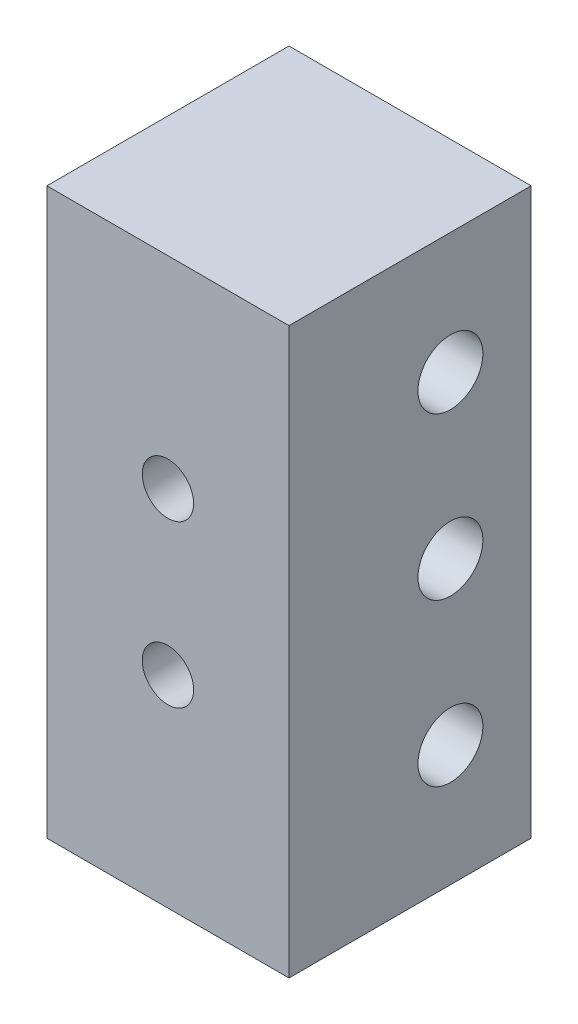
ISO-10303-21;
HEADER;
FILE_DESCRIPTION(('STEP AP214'),'2;1');
FILE_NAME('part.step','',(''),(''),'','','');
FILE_SCHEMA(('AUTOMOTIVE_DESIGN { 1 0 10303 214 1 1 1 1 }'));
ENDSEC;
DATA;
#1=APPLICATION_CONTEXT('core data for automotive mechanical design processes');
#2=APPLICATION_PROTOCOL_DEFINITION('international standard','automotive_design',2000,#1);
#3=PRODUCT_CONTEXT('',#1,'mechanical');
#4=PRODUCT('Part','Part','',(#3));
#5=PRODUCT_RELATED_PRODUCT_CATEGORY('part','',(#4));
#6=PRODUCT_DEFINITION_FORMATION('','',#4);
#7=PRODUCT_DEFINITION_CONTEXT('part definition',#1,'design');
#8=PRODUCT_DEFINITION('design','',#6,#7);
#9=PRODUCT_DEFINITION_SHAPE('','',#8);
#10=(LENGTH_UNIT() NAMED_UNIT(*) SI_UNIT(.MILLI.,.METRE.));
#11=(NAMED_UNIT(*) PLANE_ANGLE_UNIT() SI_UNIT($,.RADIAN.));
#12=(NAMED_UNIT(*) SI_UNIT($,.STERADIAN.) SOLID_ANGLE_UNIT());
#13=UNCERTAINTY_MEASURE_WITH_UNIT(LENGTH_MEASURE(1.E-05),#10,'distance_accuracy_value','');
#14=(GEOMETRIC_REPRESENTATION_CONTEXT(3) GLOBAL_UNCERTAINTY_ASSIGNED_CONTEXT((#13)) GLOBAL_UNIT_ASSIGNED_CONTEXT((#10,
#11,#12)) REPRESENTATION_CONTEXT('',''));
#15=CARTESIAN_POINT('',(0.,0.,0.));
#16=DIRECTION('',(0.,0.,1.));
#17=DIRECTION('',(1.,0.,0.));
#18=AXIS2_PLACEMENT_3D('',#15,#16,#17);
#19=CARTESIAN_POINT('',(0.,22.225,0.));
#20=DIRECTION('',(1.,0.,0.));
#21=DIRECTION('',(0.,0.,-1.));
#22=AXIS2_PLACEMENT_3D('',#19,#20,#21);
#23=PLANE('',#22);
#24=CARTESIAN_POINT('',(0.,12.7,-12.7));
#25=DIRECTION('',(-1.,0.,0.));
#26=DIRECTION('',(0.,0.,1.));
#27=AXIS2_PLACEMENT_3D('',#24,#25,#26);
#28=CIRCLE('',#27,2.5527);
#29=CARTESIAN_POINT('',(0.,12.7,-10.1473));
#30=VERTEX_POINT('',#29);
#31=EDGE_CURVE('E132',#30,#30,#28,.T.);
#32=ORIENTED_EDGE('',*,*,#31,.F.);
#33=EDGE_LOOP('',(#32));
#34=FACE_BOUND('',#33,.T.);
#35=CARTESIAN_POINT('',(0.,-12.7,-12.7));
#36=DIRECTION('',(-1.,0.,0.));
#37=DIRECTION('',(0.,0.,1.));
#38=AXIS2_PLACEMENT_3D('',#35,#36,#37);
#39=CIRCLE('',#38,2.5527);
#40=CARTESIAN_POINT('',(0.,-12.7,-10.1473));
#41=VERTEX_POINT('',#40);
#42=EDGE_CURVE('E126',#41,#41,#39,.T.);
#43=ORIENTED_EDGE('',*,*,#42,.F.);
#44=EDGE_LOOP('',(#43));
#45=FACE_BOUND('',#44,.T.);
#46=CARTESIAN_POINT('',(0.,0.,-12.7));
#47=DIRECTION('',(-1.,0.,0.));
#48=DIRECTION('',(0.,0.,1.));
#49=AXIS2_PLACEMENT_3D('',#46,#47,#48);
#50=CIRCLE('',#49,2.5527);
#51=CARTESIAN_POINT('',(0.,0.,-10.1473));
#52=VERTEX_POINT('',#51);
#53=EDGE_CURVE('E119',#52,#52,#50,.T.);
#54=ORIENTED_EDGE('',*,*,#53,.F.);
#55=EDGE_LOOP('',(#54));
#56=FACE_BOUND('',#55,.T.);
#57=DIRECTION('',(0.,0.,1.));
#58=VECTOR('',#57,1.);
#59=CARTESIAN_POINT('',(0.,-22.225,0.));
#60=LINE('',#59,#58);
#61=CARTESIAN_POINT('',(0.,-22.225,-19.05));
#62=VERTEX_POINT('',#61);
#63=CARTESIAN_POINT('',(0.,-22.225,0.));
#64=VERTEX_POINT('',#63);
#65=EDGE_CURVE('E105',#62,#64,#60,.T.);
#66=ORIENTED_EDGE('',*,*,#65,.T.);
#67=DIRECTION('',(0.,-1.,0.));
#68=VECTOR('',#67,1.);
#69=CARTESIAN_POINT('',(0.,22.225,0.));
#70=LINE('',#69,#68);
#71=CARTESIAN_POINT('',(0.,22.225,0.));
#72=VERTEX_POINT('',#71);
#73=EDGE_CURVE('E11',#72,#64,#70,.T.);
#74=ORIENTED_EDGE('',*,*,#73,.F.);
#75=DIRECTION('',(0.,0.,1.));
#76=VECTOR('',#75,1.);
#77=CARTESIAN_POINT('',(0.,22.225,0.));
#78=LINE('',#77,#76);
#79=CARTESIAN_POINT('',(0.,22.225,-19.05));
#80=VERTEX_POINT('',#79);
#81=EDGE_CURVE('E93',#80,#72,#78,.T.);
#82=ORIENTED_EDGE('',*,*,#81,.F.);
#83=DIRECTION('',(0.,-1.,0.));
#84=VECTOR('',#83,1.);
#85=CARTESIAN_POINT('',(0.,22.225,-19.05));
#86=LINE('',#85,#84);
#87=EDGE_CURVE('E101',#80,#62,#86,.T.);
#88=ORIENTED_EDGE('',*,*,#87,.T.);
#89=EDGE_LOOP('',(#66,#74,#82,#88));
#90=FACE_BOUND('',#89,.T.);
#91=ADVANCED_FACE('F42',(#34,#45,#56,#90),#23,.F.);
#92=CARTESIAN_POINT('',(0.,22.225,0.));
#93=DIRECTION('',(0.,0.,-1.));
#94=DIRECTION('',(-1.,0.,0.));
#95=AXIS2_PLACEMENT_3D('',#92,#93,#94);
#96=PLANE('',#95);
#97=CARTESIAN_POINT('',(9.525,-6.35,0.));
#98=DIRECTION('',(0.,0.,-1.));
#99=DIRECTION('',(-1.,0.,0.));
#100=AXIS2_PLACEMENT_3D('',#97,#98,#99);
#101=CIRCLE('',#100,2.01929999999999);
#102=CARTESIAN_POINT('',(7.50570000000001,-6.35,0.));
#103=VERTEX_POINT('',#102);
#104=EDGE_CURVE('E142',#103,#103,#101,.T.);
#105=ORIENTED_EDGE('',*,*,#104,.T.);
#106=EDGE_LOOP('',(#105));
#107=FACE_BOUND('',#106,.T.);
#108=CARTESIAN_POINT('',(9.525,6.35,0.));
#109=DIRECTION('',(0.,0.,-1.));
#110=DIRECTION('',(-1.,0.,0.));
#111=AXIS2_PLACEMENT_3D('',#108,#109,#110);
#112=CIRCLE('',#111,2.01929999999999);
#113=CARTESIAN_POINT('',(7.50570000000001,6.35,0.));
#114=VERTEX_POINT('',#113);
#115=EDGE_CURVE('E123',#114,#114,#112,.T.);
#116=ORIENTED_EDGE('',*,*,#115,.T.);
#117=EDGE_LOOP('',(#116));
#118=FACE_BOUND('',#117,.T.);
#119=DIRECTION('',(1.,0.,0.));
#120=VECTOR('',#119,1.);
#121=CARTESIAN_POINT('',(0.,-22.225,0.));
#122=LINE('',#121,#120);
#123=CARTESIAN_POINT('',(19.05,-22.225,0.));
#124=VERTEX_POINT('',#123);
#125=EDGE_CURVE('E97',#64,#124,#122,.T.);
#126=ORIENTED_EDGE('',*,*,#125,.T.);
#127=DIRECTION('',(0.,-1.,0.));
#128=VECTOR('',#127,1.);
#129=CARTESIAN_POINT('',(19.05,22.225,0.));
#130=LINE('',#129,#128);
#131=CARTESIAN_POINT('',(19.05,22.225,0.));
#132=VERTEX_POINT('',#131);
#133=EDGE_CURVE('E50',#132,#124,#130,.T.);
#134=ORIENTED_EDGE('',*,*,#133,.F.);
#135=DIRECTION('',(1.,0.,0.));
#136=VECTOR('',#135,1.);
#137=CARTESIAN_POINT('',(0.,22.225,0.));
#138=LINE('',#137,#136);
#139=EDGE_CURVE('E88',#72,#132,#138,.T.);
#140=ORIENTED_EDGE('',*,*,#139,.F.);
#141=ORIENTED_EDGE('',*,*,#73,.T.);
#142=EDGE_LOOP('',(#126,#134,#140,#141));
#143=FACE_BOUND('',#142,.T.);
#144=ADVANCED_FACE('F96',(#107,#118,#143),#96,.F.);
#145=CARTESIAN_POINT('',(19.05,22.225,0.));
#146=DIRECTION('',(-1.,0.,0.));
#147=DIRECTION('',(0.,0.,1.));
#148=AXIS2_PLACEMENT_3D('',#145,#146,#147);
#149=PLANE('',#148);
#150=CARTESIAN_POINT('',(19.05,12.7,-12.7));
#151=DIRECTION('',(-1.,0.,0.));
#152=DIRECTION('',(0.,0.,1.));
#153=AXIS2_PLACEMENT_3D('',#150,#151,#152);
#154=CIRCLE('',#153,2.5527);
#155=CARTESIAN_POINT('',(19.05,12.7,-10.1473));
#156=VERTEX_POINT('',#155);
#157=EDGE_CURVE('E108',#156,#156,#154,.T.);
#158=ORIENTED_EDGE('',*,*,#157,.T.);
#159=EDGE_LOOP('',(#158));
#160=FACE_BOUND('',#159,.T.);
#161=CARTESIAN_POINT('',(19.05,-12.7,-12.7));
#162=DIRECTION('',(-1.,0.,0.));
#163=DIRECTION('',(0.,0.,1.));
#164=AXIS2_PLACEMENT_3D('',#161,#162,#163);
#165=CIRCLE('',#164,2.5527);
#166=CARTESIAN_POINT('',(19.05,-12.7,-10.1473));
#167=VERTEX_POINT('',#166);
#168=EDGE_CURVE('E129',#167,#167,#165,.T.);
#169=ORIENTED_EDGE('',*,*,#168,.T.);
#170=EDGE_LOOP('',(#169));
#171=FACE_BOUND('',#170,.T.);
#172=CARTESIAN_POINT('',(19.05,0.,-12.7));
#173=DIRECTION('',(-1.,0.,0.));
#174=DIRECTION('',(0.,0.,1.));
#175=AXIS2_PLACEMENT_3D('',#172,#173,#174);
#176=CIRCLE('',#175,2.5527);
#177=CARTESIAN_POINT('',(19.05,0.,-10.1473));
#178=VERTEX_POINT('',#177);
#179=EDGE_CURVE('E122',#178,#178,#176,.T.);
#180=ORIENTED_EDGE('',*,*,#179,.T.);
#181=EDGE_LOOP('',(#180));
#182=FACE_BOUND('',#181,.T.);
#183=DIRECTION('',(0.,0.,-1.));
#184=VECTOR('',#183,1.);
#185=CARTESIAN_POINT('',(19.05,-22.225,0.));
#186=LINE('',#185,#184);
#187=CARTESIAN_POINT('',(19.05,-22.225,-19.05));
#188=VERTEX_POINT('',#187);
#189=EDGE_CURVE('E75',#124,#188,#186,.T.);
#190=ORIENTED_EDGE('',*,*,#189,.T.);
#191=DIRECTION('',(0.,-1.,0.));
#192=VECTOR('',#191,1.);
#193=CARTESIAN_POINT('',(19.05,22.225,-19.05));
#194=LINE('',#193,#192);
#195=CARTESIAN_POINT('',(19.05,22.225,-19.05));
#196=VERTEX_POINT('',#195);
#197=EDGE_CURVE('E98',#196,#188,#194,.T.);
#198=ORIENTED_EDGE('',*,*,#197,.F.);
#199=DIRECTION('',(0.,0.,-1.));
#200=VECTOR('',#199,1.);
#201=CARTESIAN_POINT('',(19.05,22.225,0.));
#202=LINE('',#201,#200);
#203=EDGE_CURVE('E91',#132,#196,#202,.T.);
#204=ORIENTED_EDGE('',*,*,#203,.F.);
#205=ORIENTED_EDGE('',*,*,#133,.T.);
#206=EDGE_LOOP('',(#190,#198,#204,#205));
#207=FACE_BOUND('',#206,.T.);
#208=ADVANCED_FACE('F99',(#160,#171,#182,#207),#149,.F.);
#209=CARTESIAN_POINT('',(0.,22.225,-19.05));
#210=DIRECTION('',(0.,0.,1.));
#211=DIRECTION('',(1.,0.,0.));
#212=AXIS2_PLACEMENT_3D('',#209,#210,#211);
#213=PLANE('',#212);
#214=CARTESIAN_POINT('',(9.525,-6.35,-19.05));
#215=DIRECTION('',(0.,0.,-1.));
#216=DIRECTION('',(-1.,0.,0.));
#217=AXIS2_PLACEMENT_3D('',#214,#215,#216);
#218=CIRCLE('',#217,2.0193);
#219=CARTESIAN_POINT('',(7.5057,-6.35,-19.05));
#220=VERTEX_POINT('',#219);
#221=EDGE_CURVE('E145',#220,#220,#218,.T.);
#222=ORIENTED_EDGE('',*,*,#221,.F.);
#223=EDGE_LOOP('',(#222));
#224=FACE_BOUND('',#223,.T.);
#225=CARTESIAN_POINT('',(9.525,6.35,-19.05));
#226=DIRECTION('',(0.,0.,-1.));
#227=DIRECTION('',(-1.,0.,0.));
#228=AXIS2_PLACEMENT_3D('',#225,#226,#227);
#229=CIRCLE('',#228,2.0193);
#230=CARTESIAN_POINT('',(7.5057,6.35,-19.05));
#231=VERTEX_POINT('',#230);
#232=EDGE_CURVE('E139',#231,#231,#229,.T.);
#233=ORIENTED_EDGE('',*,*,#232,.F.);
#234=EDGE_LOOP('',(#233));
#235=FACE_BOUND('',#234,.T.);
#236=DIRECTION('',(-1.,0.,0.));
#237=VECTOR('',#236,1.);
#238=CARTESIAN_POINT('',(0.,-22.225,-19.05));
#239=LINE('',#238,#237);
#240=EDGE_CURVE('E81',#188,#62,#239,.T.);
#241=ORIENTED_EDGE('',*,*,#240,.T.);
#242=ORIENTED_EDGE('',*,*,#87,.F.);
#243=DIRECTION('',(-1.,0.,0.));
#244=VECTOR('',#243,1.);
#245=CARTESIAN_POINT('',(0.,22.225,-19.05));
#246=LINE('',#245,#244);
#247=EDGE_CURVE('E58',#196,#80,#246,.T.);
#248=ORIENTED_EDGE('',*,*,#247,.F.);
#249=ORIENTED_EDGE('',*,*,#197,.T.);
#250=EDGE_LOOP('',(#241,#242,#248,#249));
#251=FACE_BOUND('',#250,.T.);
#252=ADVANCED_FACE('F113',(#224,#235,#251),#213,.F.);
#253=CARTESIAN_POINT('',(0.,22.225,0.));
#254=DIRECTION('',(0.,-1.,0.));
#255=DIRECTION('',(0.,0.,-1.));
#256=AXIS2_PLACEMENT_3D('',#253,#254,#255);
#257=PLANE('',#256);
#258=ORIENTED_EDGE('',*,*,#81,.T.);
#259=ORIENTED_EDGE('',*,*,#139,.T.);
#260=ORIENTED_EDGE('',*,*,#203,.T.);
#261=ORIENTED_EDGE('',*,*,#247,.T.);
#262=EDGE_LOOP('',(#258,#259,#260,#261));
#263=FACE_BOUND('',#262,.T.);
#264=ADVANCED_FACE('F89',(#263),#257,.F.);
#265=CARTESIAN_POINT('',(0.,-22.225,0.));
#266=DIRECTION('',(0.,-1.,0.));
#267=DIRECTION('',(0.,0.,-1.));
#268=AXIS2_PLACEMENT_3D('',#265,#266,#267);
#269=PLANE('',#268);
#270=ORIENTED_EDGE('',*,*,#65,.F.);
#271=ORIENTED_EDGE('',*,*,#240,.F.);
#272=ORIENTED_EDGE('',*,*,#189,.F.);
#273=ORIENTED_EDGE('',*,*,#125,.F.);
#274=EDGE_LOOP('',(#270,#271,#272,#273));
#275=FACE_BOUND('',#274,.T.);
#276=ADVANCED_FACE('F116',(#275),#269,.T.);
#277=CARTESIAN_POINT('',(19.05,0.,-12.7));
#278=DIRECTION('',(-1.,0.,0.));
#279=DIRECTION('',(0.,0.,1.));
#280=AXIS2_PLACEMENT_3D('',#277,#278,#279);
#281=CYLINDRICAL_SURFACE('',#280,2.5527);
#282=CARTESIAN_POINT('',(19.05,0.,-10.1473));
#283=CARTESIAN_POINT('',(18.8515625,0.,-10.1473));
#284=CARTESIAN_POINT('',(18.653125,0.,-10.1473));
#285=CARTESIAN_POINT('',(18.25625,0.,-10.1473));
#286=CARTESIAN_POINT('',(18.0578125,0.,-10.1473));
#287=CARTESIAN_POINT('',(17.6609375,0.,-10.1473));
#288=CARTESIAN_POINT('',(17.4625,0.,-10.1473));
#289=CARTESIAN_POINT('',(17.065625,0.,-10.1473));
#290=CARTESIAN_POINT('',(16.8671875,0.,-10.1473));
#291=CARTESIAN_POINT('',(16.4703125,0.,-10.1473));
#292=CARTESIAN_POINT('',(16.271875,0.,-10.1473));
#293=CARTESIAN_POINT('',(15.875,0.,-10.1473));
#294=CARTESIAN_POINT('',(15.6765625,0.,-10.1473));
#295=CARTESIAN_POINT('',(15.2796875,0.,-10.1473));
#296=CARTESIAN_POINT('',(15.08125,0.,-10.1473));
#297=CARTESIAN_POINT('',(14.684375,0.,-10.1473));
#298=CARTESIAN_POINT('',(14.4859375,0.,-10.1473));
#299=CARTESIAN_POINT('',(14.0890625,0.,-10.1473));
#300=CARTESIAN_POINT('',(13.890625,0.,-10.1473));
#301=CARTESIAN_POINT('',(13.49375,0.,-10.1473));
#302=CARTESIAN_POINT('',(13.2953125,0.,-10.1473));
#303=CARTESIAN_POINT('',(12.8984375,0.,-10.1473));
#304=CARTESIAN_POINT('',(12.7,0.,-10.1473));
#305=CARTESIAN_POINT('',(12.303125,0.,-10.1473));
#306=CARTESIAN_POINT('',(12.1046875,0.,-10.1473));
#307=CARTESIAN_POINT('',(11.7078125,0.,-10.1473));
#308=CARTESIAN_POINT('',(11.509375,0.,-10.1473));
#309=CARTESIAN_POINT('',(11.1125,0.,-10.1473));
#310=CARTESIAN_POINT('',(10.9140625,0.,-10.1473));
#311=CARTESIAN_POINT('',(10.5171875,0.,-10.1473));
#312=CARTESIAN_POINT('',(10.31875,0.,-10.1473));
#313=CARTESIAN_POINT('',(9.921875,0.,-10.1473));
#314=CARTESIAN_POINT('',(9.7234375,0.,-10.1473));
#315=CARTESIAN_POINT('',(9.3265625,0.,-10.1473));
#316=CARTESIAN_POINT('',(9.128125,0.,-10.1473));
#317=CARTESIAN_POINT('',(8.73125,0.,-10.1473));
#318=CARTESIAN_POINT('',(8.5328125,0.,-10.1473));
#319=CARTESIAN_POINT('',(8.1359375,0.,-10.1473));
#320=CARTESIAN_POINT('',(7.9375,0.,-10.1473));
#321=CARTESIAN_POINT('',(7.540625,0.,-10.1473));
#322=CARTESIAN_POINT('',(7.3421875,0.,-10.1473));
#323=CARTESIAN_POINT('',(6.9453125,0.,-10.1473));
#324=CARTESIAN_POINT('',(6.746875,0.,-10.1473));
#325=CARTESIAN_POINT('',(6.35,0.,-10.1473));
#326=CARTESIAN_POINT('',(6.1515625,0.,-10.1473));
#327=CARTESIAN_POINT('',(5.7546875,0.,-10.1473));
#328=CARTESIAN_POINT('',(5.55625,0.,-10.1473));
#329=CARTESIAN_POINT('',(5.159375,0.,-10.1473));
#330=CARTESIAN_POINT('',(4.9609375,0.,-10.1473));
#331=CARTESIAN_POINT('',(4.5640625,0.,-10.1473));
#332=CARTESIAN_POINT('',(4.365625,0.,-10.1473));
#333=CARTESIAN_POINT('',(3.96875,0.,-10.1473));
#334=CARTESIAN_POINT('',(3.7703125,0.,-10.1473));
#335=CARTESIAN_POINT('',(3.3734375,0.,-10.1473));
#336=CARTESIAN_POINT('',(3.175,0.,-10.1473));
#337=CARTESIAN_POINT('',(2.778125,0.,-10.1473));
#338=CARTESIAN_POINT('',(2.5796875,0.,-10.1473));
#339=CARTESIAN_POINT('',(2.1828125,0.,-10.1473));
#340=CARTESIAN_POINT('',(1.984375,0.,-10.1473));
#341=CARTESIAN_POINT('',(1.5875,0.,-10.1473));
#342=CARTESIAN_POINT('',(1.3890625,0.,-10.1473));
#343=CARTESIAN_POINT('',(0.992187500000001,0.,-10.1473));
#344=CARTESIAN_POINT('',(0.793750000000001,0.,-10.1473));
#345=CARTESIAN_POINT('',(0.396875,0.,-10.1473));
#346=CARTESIAN_POINT('',(0.1984375,0.,-10.1473));
#347=CARTESIAN_POINT('',(0.,0.,-10.1473));
#348=B_SPLINE_CURVE_WITH_KNOTS('',3,(#282,#283,#284,#285,#286,#287,#288,#289,#290,#291,#292,
#293,#294,#295,#296,#297,#298,#299,#300,#301,#302,#303,#304,#305,#306,#307,#308,#309,#310,#311,
#312,#313,#314,#315,#316,#317,#318,#319,#320,#321,#322,#323,#324,#325,#326,#327,#328,#329,#330,
#331,#332,#333,#334,#335,#336,#337,#338,#339,#340,#341,#342,#343,#344,#345,#346,#347),
.UNSPECIFIED.,.F.,.F.,(4,2,2,2,2,2,2,2,2,2,2,2,2,2,2,2,2,2,2,2,2,2,2,2,2,2,2,2,2,2,2,2,4),(0.,
0.595312499999997,1.190625,1.7859375,2.38125,2.9765625,3.571875,4.1671875,4.7625,5.3578125,
5.953125,6.5484375,7.14375,7.7390625,8.334375,8.9296875,9.525,10.1203125,10.715625,11.3109375,
11.90625,12.5015625,13.096875,13.6921875,14.2875,14.8828125,15.478125,16.0734375,16.66875,
17.2640625,17.859375,18.4546875,19.05),.UNSPECIFIED.);
#349=EDGE_CURVE('BSEAM183',#178,#52,#348,.T.);
#350=ORIENTED_EDGE('',*,*,#179,.F.);
#351=ORIENTED_EDGE('',*,*,#53,.T.);
#352=ORIENTED_EDGE('',*,*,#349,.T.);
#353=ORIENTED_EDGE('',*,*,#349,.F.);
#354=EDGE_LOOP('',(#350,#352,#351,#353));
#355=FACE_BOUND('',#354,.T.);
#356=ADVANCED_FACE('F183',(#355),#281,.F.);
#357=CARTESIAN_POINT('',(19.05,-12.7,-12.7));
#358=DIRECTION('',(-1.,0.,0.));
#359=DIRECTION('',(0.,0.,1.));
#360=AXIS2_PLACEMENT_3D('',#357,#358,#359);
#361=CYLINDRICAL_SURFACE('',#360,2.5527);
#362=CARTESIAN_POINT('',(19.05,-12.7,-10.1473));
#363=CARTESIAN_POINT('',(18.8515625,-12.7,-10.1473));
#364=CARTESIAN_POINT('',(18.653125,-12.7,-10.1473));
#365=CARTESIAN_POINT('',(18.25625,-12.7,-10.1473));
#366=CARTESIAN_POINT('',(18.0578125,-12.7,-10.1473));
#367=CARTESIAN_POINT('',(17.6609375,-12.7,-10.1473));
#368=CARTESIAN_POINT('',(17.4625,-12.7,-10.1473));
#369=CARTESIAN_POINT('',(17.065625,-12.7,-10.1473));
#370=CARTESIAN_POINT('',(16.8671875,-12.7,-10.1473));
#371=CARTESIAN_POINT('',(16.4703125,-12.7,-10.1473));
#372=CARTESIAN_POINT('',(16.271875,-12.7,-10.1473));
#373=CARTESIAN_POINT('',(15.875,-12.7,-10.1473));
#374=CARTESIAN_POINT('',(15.6765625,-12.7,-10.1473));
#375=CARTESIAN_POINT('',(15.2796875,-12.7,-10.1473));
#376=CARTESIAN_POINT('',(15.08125,-12.7,-10.1473));
#377=CARTESIAN_POINT('',(14.684375,-12.7,-10.1473));
#378=CARTESIAN_POINT('',(14.4859375,-12.7,-10.1473));
#379=CARTESIAN_POINT('',(14.0890625,-12.7,-10.1473));
#380=CARTESIAN_POINT('',(13.890625,-12.7,-10.1473));
#381=CARTESIAN_POINT('',(13.49375,-12.7,-10.1473));
#382=CARTESIAN_POINT('',(13.2953125,-12.7,-10.1473));
#383=CARTESIAN_POINT('',(12.8984375,-12.7,-10.1473));
#384=CARTESIAN_POINT('',(12.7,-12.7,-10.1473));
#385=CARTESIAN_POINT('',(12.303125,-12.7,-10.1473));
#386=CARTESIAN_POINT('',(12.1046875,-12.7,-10.1473));
#387=CARTESIAN_POINT('',(11.7078125,-12.7,-10.1473));
#388=CARTESIAN_POINT('',(11.509375,-12.7,-10.1473));
#389=CARTESIAN_POINT('',(11.1125,-12.7,-10.1473));
#390=CARTESIAN_POINT('',(10.9140625,-12.7,-10.1473));
#391=CARTESIAN_POINT('',(10.5171875,-12.7,-10.1473));
#392=CARTESIAN_POINT('',(10.31875,-12.7,-10.1473));
#393=CARTESIAN_POINT('',(9.921875,-12.7,-10.1473));
#394=CARTESIAN_POINT('',(9.7234375,-12.7,-10.1473));
#395=CARTESIAN_POINT('',(9.3265625,-12.7,-10.1473));
#396=CARTESIAN_POINT('',(9.128125,-12.7,-10.1473));
#397=CARTESIAN_POINT('',(8.73125,-12.7,-10.1473));
#398=CARTESIAN_POINT('',(8.5328125,-12.7,-10.1473));
#399=CARTESIAN_POINT('',(8.1359375,-12.7,-10.1473));
#400=CARTESIAN_POINT('',(7.9375,-12.7,-10.1473));
#401=CARTESIAN_POINT('',(7.540625,-12.7,-10.1473));
#402=CARTESIAN_POINT('',(7.3421875,-12.7,-10.1473));
#403=CARTESIAN_POINT('',(6.9453125,-12.7,-10.1473));
#404=CARTESIAN_POINT('',(6.746875,-12.7,-10.1473));
#405=CARTESIAN_POINT('',(6.35,-12.7,-10.1473));
#406=CARTESIAN_POINT('',(6.1515625,-12.7,-10.1473));
#407=CARTESIAN_POINT('',(5.7546875,-12.7,-10.1473));
#408=CARTESIAN_POINT('',(5.55625,-12.7,-10.1473));
#409=CARTESIAN_POINT('',(5.159375,-12.7,-10.1473));
#410=CARTESIAN_POINT('',(4.9609375,-12.7,-10.1473));
#411=CARTESIAN_POINT('',(4.5640625,-12.7,-10.1473));
#412=CARTESIAN_POINT('',(4.365625,-12.7,-10.1473));
#413=CARTESIAN_POINT('',(3.96875,-12.7,-10.1473));
#414=CARTESIAN_POINT('',(3.7703125,-12.7,-10.1473));
#415=CARTESIAN_POINT('',(3.3734375,-12.7,-10.1473));
#416=CARTESIAN_POINT('',(3.175,-12.7,-10.1473));
#417=CARTESIAN_POINT('',(2.778125,-12.7,-10.1473));
#418=CARTESIAN_POINT('',(2.5796875,-12.7,-10.1473));
#419=CARTESIAN_POINT('',(2.1828125,-12.7,-10.1473));
#420=CARTESIAN_POINT('',(1.984375,-12.7,-10.1473));
#421=CARTESIAN_POINT('',(1.5875,-12.7,-10.1473));
#422=CARTESIAN_POINT('',(1.3890625,-12.7,-10.1473));
#423=CARTESIAN_POINT('',(0.992187500000001,-12.7,-10.1473));
#424=CARTESIAN_POINT('',(0.793750000000001,-12.7,-10.1473));
#425=CARTESIAN_POINT('',(0.396875,-12.7,-10.1473));
#426=CARTESIAN_POINT('',(0.1984375,-12.7,-10.1473));
#427=CARTESIAN_POINT('',(0.,-12.7,-10.1473));
#428=B_SPLINE_CURVE_WITH_KNOTS('',3,(#362,#363,#364,#365,#366,#367,#368,#369,#370,#371,#372,
#373,#374,#375,#376,#377,#378,#379,#380,#381,#382,#383,#384,#385,#386,#387,#388,#389,#390,#391,
#392,#393,#394,#395,#396,#397,#398,#399,#400,#401,#402,#403,#404,#405,#406,#407,#408,#409,#410,
#411,#412,#413,#414,#415,#416,#417,#418,#419,#420,#421,#422,#423,#424,#425,#426,#427),
.UNSPECIFIED.,.F.,.F.,(4,2,2,2,2,2,2,2,2,2,2,2,2,2,2,2,2,2,2,2,2,2,2,2,2,2,2,2,2,2,2,2,4),(0.,
0.595312499999997,1.190625,1.7859375,2.38125,2.9765625,3.571875,4.1671875,4.7625,5.3578125,
5.953125,6.5484375,7.14375,7.7390625,8.334375,8.9296875,9.525,10.1203125,10.715625,11.3109375,
11.90625,12.5015625,13.096875,13.6921875,14.2875,14.8828125,15.478125,16.0734375,16.66875,
17.2640625,17.859375,18.4546875,19.05),.UNSPECIFIED.);
#429=EDGE_CURVE('BSEAM167',#167,#41,#428,.T.);
#430=ORIENTED_EDGE('',*,*,#168,.F.);
#431=ORIENTED_EDGE('',*,*,#42,.T.);
#432=ORIENTED_EDGE('',*,*,#429,.T.);
#433=ORIENTED_EDGE('',*,*,#429,.F.);
#434=EDGE_LOOP('',(#430,#432,#431,#433));
#435=FACE_BOUND('',#434,.T.);
#436=ADVANCED_FACE('F167',(#435),#361,.F.);
#437=CARTESIAN_POINT('',(19.05,12.7,-12.7));
#438=DIRECTION('',(-1.,0.,0.));
#439=DIRECTION('',(0.,0.,1.));
#440=AXIS2_PLACEMENT_3D('',#437,#438,#439);
#441=CYLINDRICAL_SURFACE('',#440,2.5527);
#442=CARTESIAN_POINT('',(19.05,12.7,-10.1473));
#443=CARTESIAN_POINT('',(18.8515625,12.7,-10.1473));
#444=CARTESIAN_POINT('',(18.653125,12.7,-10.1473));
#445=CARTESIAN_POINT('',(18.25625,12.7,-10.1473));
#446=CARTESIAN_POINT('',(18.0578125,12.7,-10.1473));
#447=CARTESIAN_POINT('',(17.6609375,12.7,-10.1473));
#448=CARTESIAN_POINT('',(17.4625,12.7,-10.1473));
#449=CARTESIAN_POINT('',(17.065625,12.7,-10.1473));
#450=CARTESIAN_POINT('',(16.8671875,12.7,-10.1473));
#451=CARTESIAN_POINT('',(16.4703125,12.7,-10.1473));
#452=CARTESIAN_POINT('',(16.271875,12.7,-10.1473));
#453=CARTESIAN_POINT('',(15.875,12.7,-10.1473));
#454=CARTESIAN_POINT('',(15.6765625,12.7,-10.1473));
#455=CARTESIAN_POINT('',(15.2796875,12.7,-10.1473));
#456=CARTESIAN_POINT('',(15.08125,12.7,-10.1473));
#457=CARTESIAN_POINT('',(14.684375,12.7,-10.1473));
#458=CARTESIAN_POINT('',(14.4859375,12.7,-10.1473));
#459=CARTESIAN_POINT('',(14.0890625,12.7,-10.1473));
#460=CARTESIAN_POINT('',(13.890625,12.7,-10.1473));
#461=CARTESIAN_POINT('',(13.49375,12.7,-10.1473));
#462=CARTESIAN_POINT('',(13.2953125,12.7,-10.1473));
#463=CARTESIAN_POINT('',(12.8984375,12.7,-10.1473));
#464=CARTESIAN_POINT('',(12.7,12.7,-10.1473));
#465=CARTESIAN_POINT('',(12.303125,12.7,-10.1473));
#466=CARTESIAN_POINT('',(12.1046875,12.7,-10.1473));
#467=CARTESIAN_POINT('',(11.7078125,12.7,-10.1473));
#468=CARTESIAN_POINT('',(11.509375,12.7,-10.1473));
#469=CARTESIAN_POINT('',(11.1125,12.7,-10.1473));
#470=CARTESIAN_POINT('',(10.9140625,12.7,-10.1473));
#471=CARTESIAN_POINT('',(10.5171875,12.7,-10.1473));
#472=CARTESIAN_POINT('',(10.31875,12.7,-10.1473));
#473=CARTESIAN_POINT('',(9.921875,12.7,-10.1473));
#474=CARTESIAN_POINT('',(9.7234375,12.7,-10.1473));
#475=CARTESIAN_POINT('',(9.3265625,12.7,-10.1473));
#476=CARTESIAN_POINT('',(9.128125,12.7,-10.1473));
#477=CARTESIAN_POINT('',(8.73125,12.7,-10.1473));
#478=CARTESIAN_POINT('',(8.5328125,12.7,-10.1473));
#479=CARTESIAN_POINT('',(8.1359375,12.7,-10.1473));
#480=CARTESIAN_POINT('',(7.9375,12.7,-10.1473));
#481=CARTESIAN_POINT('',(7.540625,12.7,-10.1473));
#482=CARTESIAN_POINT('',(7.3421875,12.7,-10.1473));
#483=CARTESIAN_POINT('',(6.9453125,12.7,-10.1473));
#484=CARTESIAN_POINT('',(6.746875,12.7,-10.1473));
#485=CARTESIAN_POINT('',(6.35,12.7,-10.1473));
#486=CARTESIAN_POINT('',(6.1515625,12.7,-10.1473));
#487=CARTESIAN_POINT('',(5.7546875,12.7,-10.1473));
#488=CARTESIAN_POINT('',(5.55625,12.7,-10.1473));
#489=CARTESIAN_POINT('',(5.159375,12.7,-10.1473));
#490=CARTESIAN_POINT('',(4.9609375,12.7,-10.1473));
#491=CARTESIAN_POINT('',(4.5640625,12.7,-10.1473));
#492=CARTESIAN_POINT('',(4.365625,12.7,-10.1473));
#493=CARTESIAN_POINT('',(3.96875,12.7,-10.1473));
#494=CARTESIAN_POINT('',(3.7703125,12.7,-10.1473));
#495=CARTESIAN_POINT('',(3.3734375,12.7,-10.1473));
#496=CARTESIAN_POINT('',(3.175,12.7,-10.1473));
#497=CARTESIAN_POINT('',(2.778125,12.7,-10.1473));
#498=CARTESIAN_POINT('',(2.5796875,12.7,-10.1473));
#499=CARTESIAN_POINT('',(2.1828125,12.7,-10.1473));
#500=CARTESIAN_POINT('',(1.984375,12.7,-10.1473));
#501=CARTESIAN_POINT('',(1.5875,12.7,-10.1473));
#502=CARTESIAN_POINT('',(1.3890625,12.7,-10.1473));
#503=CARTESIAN_POINT('',(0.992187500000001,12.7,-10.1473));
#504=CARTESIAN_POINT('',(0.793750000000001,12.7,-10.1473));
#505=CARTESIAN_POINT('',(0.396875,12.7,-10.1473));
#506=CARTESIAN_POINT('',(0.1984375,12.7,-10.1473));
#507=CARTESIAN_POINT('',(0.,12.7,-10.1473));
#508=B_SPLINE_CURVE_WITH_KNOTS('',3,(#442,#443,#444,#445,#446,#447,#448,#449,#450,#451,#452,
#453,#454,#455,#456,#457,#458,#459,#460,#461,#462,#463,#464,#465,#466,#467,#468,#469,#470,#471,
#472,#473,#474,#475,#476,#477,#478,#479,#480,#481,#482,#483,#484,#485,#486,#487,#488,#489,#490,
#491,#492,#493,#494,#495,#496,#497,#498,#499,#500,#501,#502,#503,#504,#505,#506,#507),
.UNSPECIFIED.,.F.,.F.,(4,2,2,2,2,2,2,2,2,2,2,2,2,2,2,2,2,2,2,2,2,2,2,2,2,2,2,2,2,2,2,2,4),(0.,
0.595312499999997,1.190625,1.7859375,2.38125,2.9765625,3.571875,4.1671875,4.7625,5.3578125,
5.953125,6.5484375,7.14375,7.7390625,8.334375,8.9296875,9.525,10.1203125,10.715625,11.3109375,
11.90625,12.5015625,13.096875,13.6921875,14.2875,14.8828125,15.478125,16.0734375,16.66875,
17.2640625,17.859375,18.4546875,19.05),.UNSPECIFIED.);
#509=EDGE_CURVE('BSEAM158',#156,#30,#508,.T.);
#510=ORIENTED_EDGE('',*,*,#157,.F.);
#511=ORIENTED_EDGE('',*,*,#31,.T.);
#512=ORIENTED_EDGE('',*,*,#509,.T.);
#513=ORIENTED_EDGE('',*,*,#509,.F.);
#514=EDGE_LOOP('',(#510,#512,#511,#513));
#515=FACE_BOUND('',#514,.T.);
#516=ADVANCED_FACE('F158',(#515),#441,.F.);
#517=CARTESIAN_POINT('',(9.525,6.35,-19.05));
#518=DIRECTION('',(0.,0.,-1.));
#519=DIRECTION('',(-1.,0.,0.));
#520=AXIS2_PLACEMENT_3D('',#517,#518,#519);
#521=CYLINDRICAL_SURFACE('',#520,2.0193);
#522=ORIENTED_EDGE('',*,*,#115,.F.);
#523=EDGE_LOOP('',(#522));
#524=FACE_BOUND('',#523,.T.);
#525=ORIENTED_EDGE('',*,*,#232,.T.);
#526=EDGE_LOOP('',(#525));
#527=FACE_BOUND('',#526,.T.);
#528=ADVANCED_FACE('F156',(#524,#527),#521,.F.);
#529=CARTESIAN_POINT('',(9.525,-6.35,-19.05));
#530=DIRECTION('',(0.,0.,-1.));
#531=DIRECTION('',(-1.,0.,0.));
#532=AXIS2_PLACEMENT_3D('',#529,#530,#531);
#533=CYLINDRICAL_SURFACE('',#532,2.0193);
#534=ORIENTED_EDGE('',*,*,#104,.F.);
#535=EDGE_LOOP('',(#534));
#536=FACE_BOUND('',#535,.T.);
#537=ORIENTED_EDGE('',*,*,#221,.T.);
#538=EDGE_LOOP('',(#537));
#539=FACE_BOUND('',#538,.T.);
#540=ADVANCED_FACE('F149',(#536,#539),#533,.F.);
#541=CLOSED_SHELL('',(#91,#144,#208,#252,#264,#276,#356,#436,#516,#528,#540));
#542=MANIFOLD_SOLID_BREP('B2',#541);
#543=ADVANCED_BREP_SHAPE_REPRESENTATION('',(#18,#542),#14);
#544=SHAPE_DEFINITION_REPRESENTATION(#9,#543);
ENDSEC;
END-ISO-10303-21;
